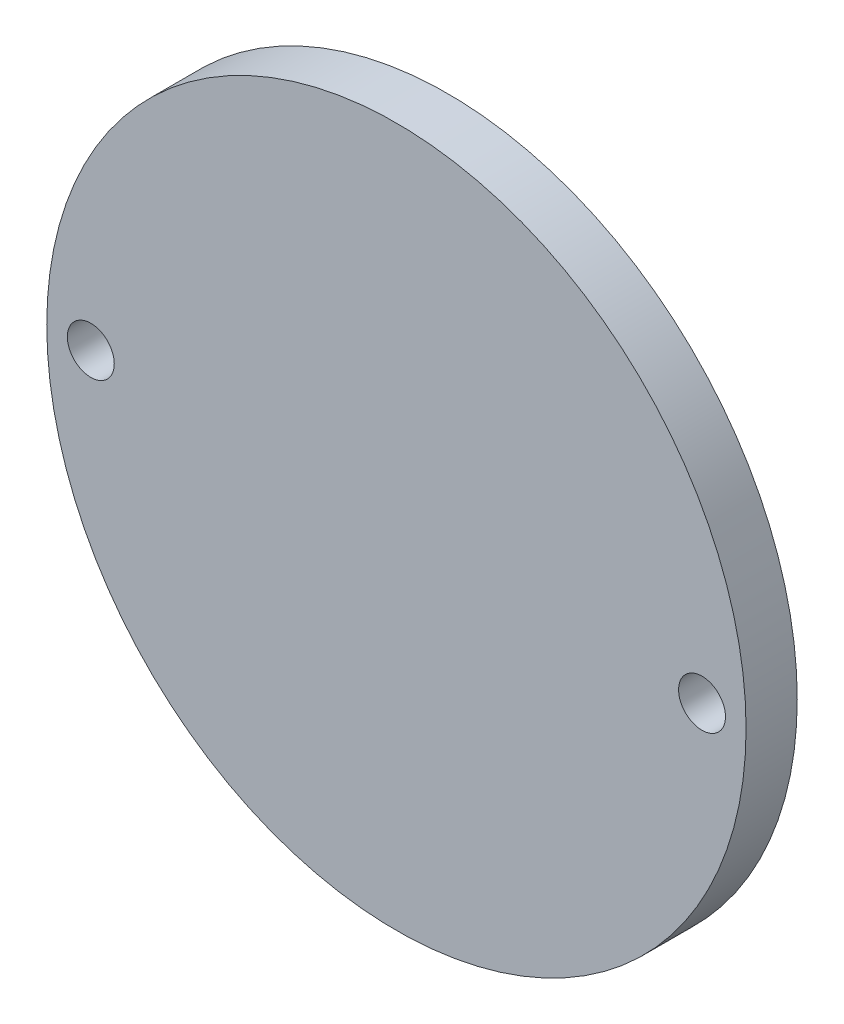
ISO-10303-21;
HEADER;
FILE_DESCRIPTION(('STEP AP214'),'2;1');
FILE_NAME('part.step','',(''),(''),'','','');
FILE_SCHEMA(('AUTOMOTIVE_DESIGN { 1 0 10303 214 1 1 1 1 }'));
ENDSEC;
DATA;
#1=APPLICATION_CONTEXT('core data for automotive mechanical design processes');
#2=APPLICATION_PROTOCOL_DEFINITION('international standard','automotive_design',2000,#1);
#3=PRODUCT_CONTEXT('',#1,'mechanical');
#4=PRODUCT('Part','Part','',(#3));
#5=PRODUCT_RELATED_PRODUCT_CATEGORY('part','',(#4));
#6=PRODUCT_DEFINITION_FORMATION('','',#4);
#7=PRODUCT_DEFINITION_CONTEXT('part definition',#1,'design');
#8=PRODUCT_DEFINITION('design','',#6,#7);
#9=PRODUCT_DEFINITION_SHAPE('','',#8);
#10=(LENGTH_UNIT() NAMED_UNIT(*) SI_UNIT(.MILLI.,.METRE.));
#11=(NAMED_UNIT(*) PLANE_ANGLE_UNIT() SI_UNIT($,.RADIAN.));
#12=(NAMED_UNIT(*) SI_UNIT($,.STERADIAN.) SOLID_ANGLE_UNIT());
#13=UNCERTAINTY_MEASURE_WITH_UNIT(LENGTH_MEASURE(1.E-05),#10,'distance_accuracy_value','');
#14=(GEOMETRIC_REPRESENTATION_CONTEXT(3) GLOBAL_UNCERTAINTY_ASSIGNED_CONTEXT((#13)) GLOBAL_UNIT_ASSIGNED_CONTEXT((#10,
#11,#12)) REPRESENTATION_CONTEXT('',''));
#15=CARTESIAN_POINT('',(0.,0.,0.));
#16=DIRECTION('',(0.,0.,1.));
#17=DIRECTION('',(1.,0.,0.));
#18=AXIS2_PLACEMENT_3D('',#15,#16,#17);
#19=CARTESIAN_POINT('',(0.,0.,3.6));
#20=DIRECTION('',(0.,0.,-1.));
#21=DIRECTION('',(-1.,0.,0.));
#22=AXIS2_PLACEMENT_3D('',#19,#20,#21);
#23=CYLINDRICAL_SURFACE('',#22,24.6);
#24=CARTESIAN_POINT('',(0.,0.,3.6));
#25=DIRECTION('',(0.,0.,1.));
#26=DIRECTION('',(1.,0.,0.));
#27=AXIS2_PLACEMENT_3D('',#24,#25,#26);
#28=CIRCLE('',#27,24.6);
#29=CARTESIAN_POINT('',(24.6,0.,3.6));
#30=VERTEX_POINT('',#29);
#31=EDGE_CURVE('E10',#30,#30,#28,.T.);
#32=ORIENTED_EDGE('',*,*,#31,.F.);
#33=EDGE_LOOP('',(#32));
#34=FACE_BOUND('',#33,.T.);
#35=CARTESIAN_POINT('',(0.,0.,0.));
#36=DIRECTION('',(0.,0.,1.));
#37=DIRECTION('',(1.,0.,0.));
#38=AXIS2_PLACEMENT_3D('',#35,#36,#37);
#39=CIRCLE('',#38,24.6);
#40=CARTESIAN_POINT('',(24.6,0.,0.));
#41=VERTEX_POINT('',#40);
#42=EDGE_CURVE('E41',#41,#41,#39,.T.);
#43=ORIENTED_EDGE('',*,*,#42,.T.);
#44=EDGE_LOOP('',(#43));
#45=FACE_BOUND('',#44,.T.);
#46=ADVANCED_FACE('F38',(#34,#45),#23,.T.);
#47=CARTESIAN_POINT('',(0.,0.,3.6));
#48=DIRECTION('',(0.,0.,1.));
#49=DIRECTION('',(1.,0.,0.));
#50=AXIS2_PLACEMENT_3D('',#47,#48,#49);
#51=PLANE('',#50);
#52=CARTESIAN_POINT('',(-21.5,0.,3.6));
#53=DIRECTION('',(0.,0.,1.));
#54=DIRECTION('',(1.,0.,0.));
#55=AXIS2_PLACEMENT_3D('',#52,#53,#54);
#56=CIRCLE('',#55,1.65);
#57=CARTESIAN_POINT('',(-19.85,0.,3.6));
#58=VERTEX_POINT('',#57);
#59=EDGE_CURVE('E56',#58,#58,#56,.T.);
#60=ORIENTED_EDGE('',*,*,#59,.F.);
#61=EDGE_LOOP('',(#60));
#62=FACE_BOUND('',#61,.T.);
#63=CARTESIAN_POINT('',(21.5,0.,3.6));
#64=DIRECTION('',(0.,0.,1.));
#65=DIRECTION('',(1.,0.,0.));
#66=AXIS2_PLACEMENT_3D('',#63,#64,#65);
#67=CIRCLE('',#66,1.65);
#68=CARTESIAN_POINT('',(23.15,0.,3.6));
#69=VERTEX_POINT('',#68);
#70=EDGE_CURVE('E50',#69,#69,#67,.T.);
#71=ORIENTED_EDGE('',*,*,#70,.F.);
#72=EDGE_LOOP('',(#71));
#73=FACE_BOUND('',#72,.T.);
#74=ORIENTED_EDGE('',*,*,#31,.T.);
#75=EDGE_LOOP('',(#74));
#76=FACE_BOUND('',#75,.T.);
#77=ADVANCED_FACE('F72',(#62,#73,#76),#51,.T.);
#78=CARTESIAN_POINT('',(0.,0.,0.));
#79=DIRECTION('',(0.,0.,1.));
#80=DIRECTION('',(1.,0.,0.));
#81=AXIS2_PLACEMENT_3D('',#78,#79,#80);
#82=PLANE('',#81);
#83=CARTESIAN_POINT('',(-21.5,0.,0.));
#84=DIRECTION('',(0.,0.,1.));
#85=DIRECTION('',(1.,0.,0.));
#86=AXIS2_PLACEMENT_3D('',#83,#84,#85);
#87=CIRCLE('',#86,1.65);
#88=CARTESIAN_POINT('',(-19.85,0.,0.));
#89=VERTEX_POINT('',#88);
#90=EDGE_CURVE('E48',#89,#89,#87,.T.);
#91=ORIENTED_EDGE('',*,*,#90,.T.);
#92=EDGE_LOOP('',(#91));
#93=FACE_BOUND('',#92,.T.);
#94=CARTESIAN_POINT('',(21.5,0.,0.));
#95=DIRECTION('',(0.,0.,1.));
#96=DIRECTION('',(1.,0.,0.));
#97=AXIS2_PLACEMENT_3D('',#94,#95,#96);
#98=CIRCLE('',#97,1.65);
#99=CARTESIAN_POINT('',(23.15,0.,0.));
#100=VERTEX_POINT('',#99);
#101=EDGE_CURVE('E53',#100,#100,#98,.T.);
#102=ORIENTED_EDGE('',*,*,#101,.T.);
#103=EDGE_LOOP('',(#102));
#104=FACE_BOUND('',#103,.T.);
#105=ORIENTED_EDGE('',*,*,#42,.F.);
#106=EDGE_LOOP('',(#105));
#107=FACE_BOUND('',#106,.T.);
#108=ADVANCED_FACE('F62',(#93,#104,#107),#82,.F.);
#109=CARTESIAN_POINT('',(21.5,0.,0.));
#110=DIRECTION('',(0.,0.,1.));
#111=DIRECTION('',(1.,0.,0.));
#112=AXIS2_PLACEMENT_3D('',#109,#110,#111);
#113=CYLINDRICAL_SURFACE('',#112,1.65);
#114=ORIENTED_EDGE('',*,*,#101,.F.);
#115=EDGE_LOOP('',(#114));
#116=FACE_BOUND('',#115,.T.);
#117=ORIENTED_EDGE('',*,*,#70,.T.);
#118=EDGE_LOOP('',(#117));
#119=FACE_BOUND('',#118,.T.);
#120=ADVANCED_FACE('F68',(#116,#119),#113,.F.);
#121=CARTESIAN_POINT('',(-21.5,0.,0.));
#122=DIRECTION('',(0.,0.,1.));
#123=DIRECTION('',(1.,0.,0.));
#124=AXIS2_PLACEMENT_3D('',#121,#122,#123);
#125=CYLINDRICAL_SURFACE('',#124,1.65);
#126=ORIENTED_EDGE('',*,*,#90,.F.);
#127=EDGE_LOOP('',(#126));
#128=FACE_BOUND('',#127,.T.);
#129=ORIENTED_EDGE('',*,*,#59,.T.);
#130=EDGE_LOOP('',(#129));
#131=FACE_BOUND('',#130,.T.);
#132=ADVANCED_FACE('F65',(#128,#131),#125,.F.);
#133=CLOSED_SHELL('',(#46,#77,#108,#120,#132));
#134=MANIFOLD_SOLID_BREP('B2',#133);
#135=ADVANCED_BREP_SHAPE_REPRESENTATION('',(#18,#134),#14);
#136=SHAPE_DEFINITION_REPRESENTATION(#9,#135);
ENDSEC;
END-ISO-10303-21;
